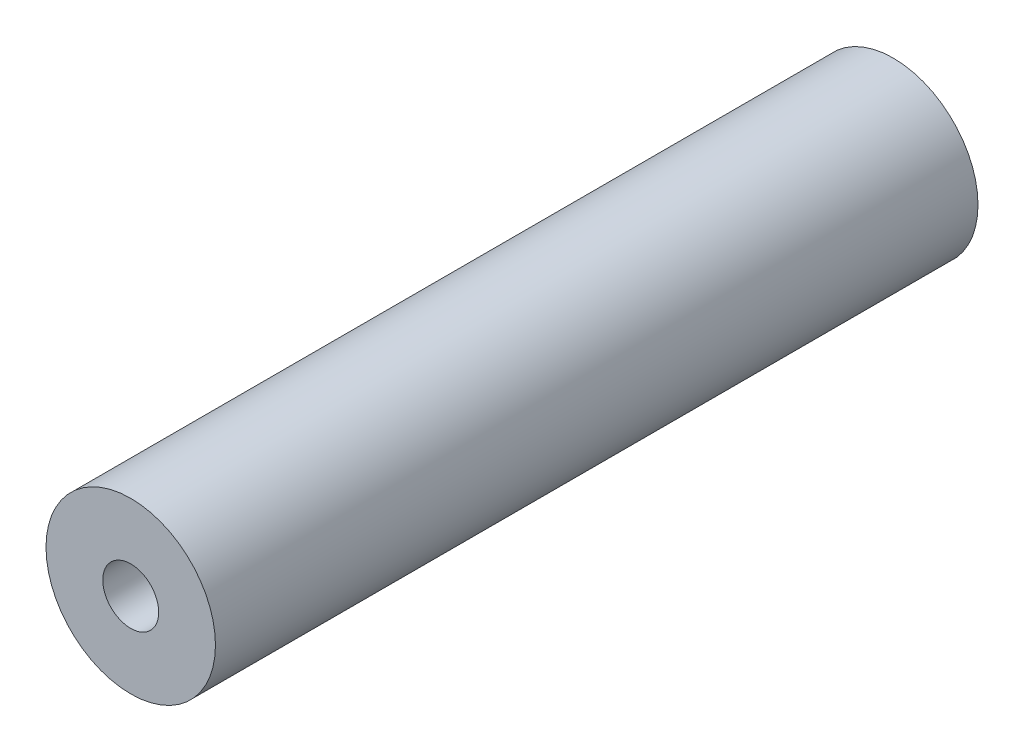
ISO-10303-21;
HEADER;
FILE_DESCRIPTION(('STEP AP214'),'2;1');
FILE_NAME('part.step','',(''),(''),'','','');
FILE_SCHEMA(('AUTOMOTIVE_DESIGN { 1 0 10303 214 1 1 1 1 }'));
ENDSEC;
DATA;
#1=APPLICATION_CONTEXT('core data for automotive mechanical design processes');
#2=APPLICATION_PROTOCOL_DEFINITION('international standard','automotive_design',2000,#1);
#3=PRODUCT_CONTEXT('',#1,'mechanical');
#4=PRODUCT('Part','Part','',(#3));
#5=PRODUCT_RELATED_PRODUCT_CATEGORY('part','',(#4));
#6=PRODUCT_DEFINITION_FORMATION('','',#4);
#7=PRODUCT_DEFINITION_CONTEXT('part definition',#1,'design');
#8=PRODUCT_DEFINITION('design','',#6,#7);
#9=PRODUCT_DEFINITION_SHAPE('','',#8);
#10=(LENGTH_UNIT() NAMED_UNIT(*) SI_UNIT(.MILLI.,.METRE.));
#11=(NAMED_UNIT(*) PLANE_ANGLE_UNIT() SI_UNIT($,.RADIAN.));
#12=(NAMED_UNIT(*) SI_UNIT($,.STERADIAN.) SOLID_ANGLE_UNIT());
#13=UNCERTAINTY_MEASURE_WITH_UNIT(LENGTH_MEASURE(1.E-05),#10,'distance_accuracy_value','');
#14=(GEOMETRIC_REPRESENTATION_CONTEXT(3) GLOBAL_UNCERTAINTY_ASSIGNED_CONTEXT((#13)) GLOBAL_UNIT_ASSIGNED_CONTEXT((#10,
#11,#12)) REPRESENTATION_CONTEXT('',''));
#15=CARTESIAN_POINT('',(0.,0.,0.));
#16=DIRECTION('',(0.,0.,1.));
#17=DIRECTION('',(1.,0.,0.));
#18=AXIS2_PLACEMENT_3D('',#15,#16,#17);
#19=CARTESIAN_POINT('',(0.,0.,45.));
#20=DIRECTION('',(0.,0.,-1.));
#21=DIRECTION('',(-1.,0.,0.));
#22=AXIS2_PLACEMENT_3D('',#19,#20,#21);
#23=CYLINDRICAL_SURFACE('',#22,5.);
#24=CARTESIAN_POINT('',(0.,0.,45.));
#25=DIRECTION('',(0.,0.,1.));
#26=DIRECTION('',(1.,0.,0.));
#27=AXIS2_PLACEMENT_3D('',#24,#25,#26);
#28=CIRCLE('',#27,5.);
#29=CARTESIAN_POINT('',(-5.,0.,45.));
#30=VERTEX_POINT('',#29);
#31=EDGE_CURVE('E11',#30,#30,#28,.T.);
#32=CARTESIAN_POINT('',(0.,0.,0.));
#33=DIRECTION('',(0.,0.,1.));
#34=DIRECTION('',(1.,0.,0.));
#35=AXIS2_PLACEMENT_3D('',#32,#33,#34);
#36=CIRCLE('',#35,5.);
#37=CARTESIAN_POINT('',(-5.,0.,0.));
#38=VERTEX_POINT('',#37);
#39=EDGE_CURVE('E36',#38,#38,#36,.T.);
#40=CARTESIAN_POINT('',(-5.,0.,45.));
#41=CARTESIAN_POINT('',(-5.,0.,44.53125));
#42=CARTESIAN_POINT('',(-5.,0.,44.0625));
#43=CARTESIAN_POINT('',(-5.,0.,43.125));
#44=CARTESIAN_POINT('',(-5.,0.,42.65625));
#45=CARTESIAN_POINT('',(-5.,0.,41.71875));
#46=CARTESIAN_POINT('',(-5.,0.,41.25));
#47=CARTESIAN_POINT('',(-5.,0.,40.3125));
#48=CARTESIAN_POINT('',(-5.,0.,39.84375));
#49=CARTESIAN_POINT('',(-5.,0.,38.90625));
#50=CARTESIAN_POINT('',(-5.,0.,38.4375));
#51=CARTESIAN_POINT('',(-5.,0.,37.5));
#52=CARTESIAN_POINT('',(-5.,0.,37.03125));
#53=CARTESIAN_POINT('',(-5.,0.,36.09375));
#54=CARTESIAN_POINT('',(-5.,0.,35.625));
#55=CARTESIAN_POINT('',(-5.,0.,34.6875));
#56=CARTESIAN_POINT('',(-5.,0.,34.21875));
#57=CARTESIAN_POINT('',(-5.,0.,33.28125));
#58=CARTESIAN_POINT('',(-5.,0.,32.8125));
#59=CARTESIAN_POINT('',(-5.,0.,31.875));
#60=CARTESIAN_POINT('',(-5.,0.,31.40625));
#61=CARTESIAN_POINT('',(-5.,0.,30.46875));
#62=CARTESIAN_POINT('',(-5.,0.,30.));
#63=CARTESIAN_POINT('',(-5.,0.,29.0625));
#64=CARTESIAN_POINT('',(-5.,0.,28.59375));
#65=CARTESIAN_POINT('',(-5.,0.,27.65625));
#66=CARTESIAN_POINT('',(-5.,0.,27.1875));
#67=CARTESIAN_POINT('',(-5.,0.,26.25));
#68=CARTESIAN_POINT('',(-5.,0.,25.78125));
#69=CARTESIAN_POINT('',(-5.,0.,24.84375));
#70=CARTESIAN_POINT('',(-5.,0.,24.375));
#71=CARTESIAN_POINT('',(-5.,0.,23.4375));
#72=CARTESIAN_POINT('',(-5.,0.,22.96875));
#73=CARTESIAN_POINT('',(-5.,0.,22.03125));
#74=CARTESIAN_POINT('',(-5.,0.,21.5625));
#75=CARTESIAN_POINT('',(-5.,0.,20.625));
#76=CARTESIAN_POINT('',(-5.,0.,20.15625));
#77=CARTESIAN_POINT('',(-5.,0.,19.21875));
#78=CARTESIAN_POINT('',(-5.,0.,18.75));
#79=CARTESIAN_POINT('',(-5.,0.,17.8125));
#80=CARTESIAN_POINT('',(-5.,0.,17.34375));
#81=CARTESIAN_POINT('',(-5.,0.,16.40625));
#82=CARTESIAN_POINT('',(-5.,0.,15.9375));
#83=CARTESIAN_POINT('',(-5.,0.,15.));
#84=CARTESIAN_POINT('',(-5.,0.,14.53125));
#85=CARTESIAN_POINT('',(-5.,0.,13.59375));
#86=CARTESIAN_POINT('',(-5.,0.,13.125));
#87=CARTESIAN_POINT('',(-5.,0.,12.1875));
#88=CARTESIAN_POINT('',(-5.,0.,11.71875));
#89=CARTESIAN_POINT('',(-5.,0.,10.78125));
#90=CARTESIAN_POINT('',(-5.,0.,10.3125));
#91=CARTESIAN_POINT('',(-5.,0.,9.375));
#92=CARTESIAN_POINT('',(-5.,0.,8.90625));
#93=CARTESIAN_POINT('',(-5.,0.,7.96874999999999));
#94=CARTESIAN_POINT('',(-5.,0.,7.5));
#95=CARTESIAN_POINT('',(-5.,0.,6.5625));
#96=CARTESIAN_POINT('',(-5.,0.,6.09375));
#97=CARTESIAN_POINT('',(-5.,0.,5.15625));
#98=CARTESIAN_POINT('',(-5.,0.,4.68749999999999));
#99=CARTESIAN_POINT('',(-5.,0.,3.74999999999999));
#100=CARTESIAN_POINT('',(-5.,0.,3.28124999999999));
#101=CARTESIAN_POINT('',(-5.,0.,2.34374999999999));
#102=CARTESIAN_POINT('',(-5.,0.,1.87499999999999));
#103=CARTESIAN_POINT('',(-5.,0.,0.937499999999992));
#104=CARTESIAN_POINT('',(-5.,0.,0.468749999999993));
#105=CARTESIAN_POINT('',(-5.,0.,0.));
#106=B_SPLINE_CURVE_WITH_KNOTS('',3,(#40,#41,#42,#43,#44,#45,#46,#47,#48,#49,#50,#51,#52,#53,
#54,#55,#56,#57,#58,#59,#60,#61,#62,#63,#64,#65,#66,#67,#68,#69,#70,#71,#72,#73,#74,#75,#76,#77,
#78,#79,#80,#81,#82,#83,#84,#85,#86,#87,#88,#89,#90,#91,#92,#93,#94,#95,#96,#97,#98,#99,#100,
#101,#102,#103,#104,#105),.UNSPECIFIED.,.F.,.F.,(4,2,2,2,2,2,2,2,2,2,2,2,2,2,2,2,2,2,2,2,2,2,2,
2,2,2,2,2,2,2,2,2,4),(0.,1.40625,2.8125,4.21875000000001,5.62500000000001,7.03125,8.4375,
9.84375000000001,11.25,12.65625,14.0625,15.46875,16.875,18.28125,19.6875,21.09375,22.5,23.90625,
25.3125,26.71875,28.125,29.53125,30.9375,32.34375,33.75,35.15625,36.5625,37.96875,39.375,
40.78125,42.1875,43.59375,45.),.UNSPECIFIED.);
#107=EDGE_CURVE('BSEAM33',#30,#38,#106,.T.);
#108=ORIENTED_EDGE('',*,*,#31,.F.);
#109=ORIENTED_EDGE('',*,*,#39,.T.);
#110=ORIENTED_EDGE('',*,*,#107,.T.);
#111=ORIENTED_EDGE('',*,*,#107,.F.);
#112=EDGE_LOOP('',(#108,#110,#109,#111));
#113=FACE_BOUND('',#112,.T.);
#114=ADVANCED_FACE('F33',(#113),#23,.T.);
#115=CARTESIAN_POINT('',(0.,0.,45.));
#116=DIRECTION('',(0.,0.,1.));
#117=DIRECTION('',(1.,0.,0.));
#118=AXIS2_PLACEMENT_3D('',#115,#116,#117);
#119=PLANE('',#118);
#120=CARTESIAN_POINT('',(0.,0.,45.));
#121=DIRECTION('',(0.,0.,1.));
#122=DIRECTION('',(1.,0.,0.));
#123=AXIS2_PLACEMENT_3D('',#120,#121,#122);
#124=CIRCLE('',#123,1.65);
#125=CARTESIAN_POINT('',(1.65,0.,45.));
#126=VERTEX_POINT('',#125);
#127=EDGE_CURVE('E56',#126,#126,#124,.T.);
#128=ORIENTED_EDGE('',*,*,#127,.F.);
#129=EDGE_LOOP('',(#128));
#130=FACE_BOUND('',#129,.T.);
#131=ORIENTED_EDGE('',*,*,#31,.T.);
#132=EDGE_LOOP('',(#131));
#133=FACE_BOUND('',#132,.T.);
#134=ADVANCED_FACE('F75',(#130,#133),#119,.T.);
#135=CARTESIAN_POINT('',(0.,0.,0.));
#136=DIRECTION('',(0.,0.,1.));
#137=DIRECTION('',(1.,0.,0.));
#138=AXIS2_PLACEMENT_3D('',#135,#136,#137);
#139=PLANE('',#138);
#140=CARTESIAN_POINT('',(0.,0.,0.));
#141=DIRECTION('',(0.,0.,-1.));
#142=DIRECTION('',(-1.,0.,0.));
#143=AXIS2_PLACEMENT_3D('',#140,#141,#142);
#144=CIRCLE('',#143,1.65);
#145=CARTESIAN_POINT('',(-1.65,0.,0.));
#146=VERTEX_POINT('',#145);
#147=EDGE_CURVE('E57',#146,#146,#144,.T.);
#148=ORIENTED_EDGE('',*,*,#147,.F.);
#149=EDGE_LOOP('',(#148));
#150=FACE_BOUND('',#149,.T.);
#151=ORIENTED_EDGE('',*,*,#39,.F.);
#152=EDGE_LOOP('',(#151));
#153=FACE_BOUND('',#152,.T.);
#154=ADVANCED_FACE('F72',(#150,#153),#139,.F.);
#155=CARTESIAN_POINT('',(0.,0.,30.));
#156=DIRECTION('',(0.,0.,1.));
#157=DIRECTION('',(1.,0.,0.));
#158=AXIS2_PLACEMENT_3D('',#155,#156,#157);
#159=CONICAL_SURFACE('',#158,1.65,1.02974425867665);
#160=CARTESIAN_POINT('',(0.,0.,29.0085799786045));
#161=VERTEX_POINT('',#160);
#162=VERTEX_LOOP('',#161);
#163=FACE_BOUND('',#162,.T.);
#164=CARTESIAN_POINT('',(0.,0.,30.));
#165=DIRECTION('',(0.,0.,1.));
#166=DIRECTION('',(1.,0.,0.));
#167=AXIS2_PLACEMENT_3D('',#164,#165,#166);
#168=CIRCLE('',#167,1.65);
#169=CARTESIAN_POINT('',(1.65,0.,30.));
#170=VERTEX_POINT('',#169);
#171=EDGE_CURVE('E60',#170,#170,#168,.T.);
#172=ORIENTED_EDGE('',*,*,#171,.T.);
#173=EDGE_LOOP('',(#172));
#174=FACE_BOUND('',#173,.T.);
#175=ADVANCED_FACE('F74',(#163,#174),#159,.F.);
#176=CARTESIAN_POINT('',(0.,0.,45.));
#177=DIRECTION('',(0.,0.,1.));
#178=DIRECTION('',(1.,0.,0.));
#179=AXIS2_PLACEMENT_3D('',#176,#177,#178);
#180=CYLINDRICAL_SURFACE('',#179,1.65);
#181=ORIENTED_EDGE('',*,*,#171,.F.);
#182=EDGE_LOOP('',(#181));
#183=FACE_BOUND('',#182,.T.);
#184=ORIENTED_EDGE('',*,*,#127,.T.);
#185=EDGE_LOOP('',(#184));
#186=FACE_BOUND('',#185,.T.);
#187=ADVANCED_FACE('F50',(#183,#186),#180,.F.);
#188=CARTESIAN_POINT('',(0.,0.,15.));
#189=DIRECTION('',(0.,0.,-1.));
#190=DIRECTION('',(-1.,0.,0.));
#191=AXIS2_PLACEMENT_3D('',#188,#189,#190);
#192=CONICAL_SURFACE('',#191,1.65,1.02974425867665);
#193=CARTESIAN_POINT('',(0.,0.,15.9914200213955));
#194=VERTEX_POINT('',#193);
#195=VERTEX_LOOP('',#194);
#196=FACE_BOUND('',#195,.T.);
#197=CARTESIAN_POINT('',(0.,0.,15.));
#198=DIRECTION('',(0.,0.,-1.));
#199=DIRECTION('',(-1.,0.,0.));
#200=AXIS2_PLACEMENT_3D('',#197,#198,#199);
#201=CIRCLE('',#200,1.65);
#202=CARTESIAN_POINT('',(-1.65,0.,15.));
#203=VERTEX_POINT('',#202);
#204=EDGE_CURVE('E54',#203,#203,#201,.T.);
#205=ORIENTED_EDGE('',*,*,#204,.T.);
#206=EDGE_LOOP('',(#205));
#207=FACE_BOUND('',#206,.T.);
#208=ADVANCED_FACE('F46',(#196,#207),#192,.F.);
#209=CARTESIAN_POINT('',(0.,0.,0.));
#210=DIRECTION('',(0.,0.,-1.));
#211=DIRECTION('',(-1.,0.,0.));
#212=AXIS2_PLACEMENT_3D('',#209,#210,#211);
#213=CYLINDRICAL_SURFACE('',#212,1.65);
#214=ORIENTED_EDGE('',*,*,#204,.F.);
#215=EDGE_LOOP('',(#214));
#216=FACE_BOUND('',#215,.T.);
#217=ORIENTED_EDGE('',*,*,#147,.T.);
#218=EDGE_LOOP('',(#217));
#219=FACE_BOUND('',#218,.T.);
#220=ADVANCED_FACE('F49',(#216,#219),#213,.F.);
#221=CLOSED_SHELL('',(#114,#134,#154,#175,#187,#208,#220));
#222=MANIFOLD_SOLID_BREP('B2',#221);
#223=ADVANCED_BREP_SHAPE_REPRESENTATION('',(#18,#222),#14);
#224=SHAPE_DEFINITION_REPRESENTATION(#9,#223);
ENDSEC;
END-ISO-10303-21;
